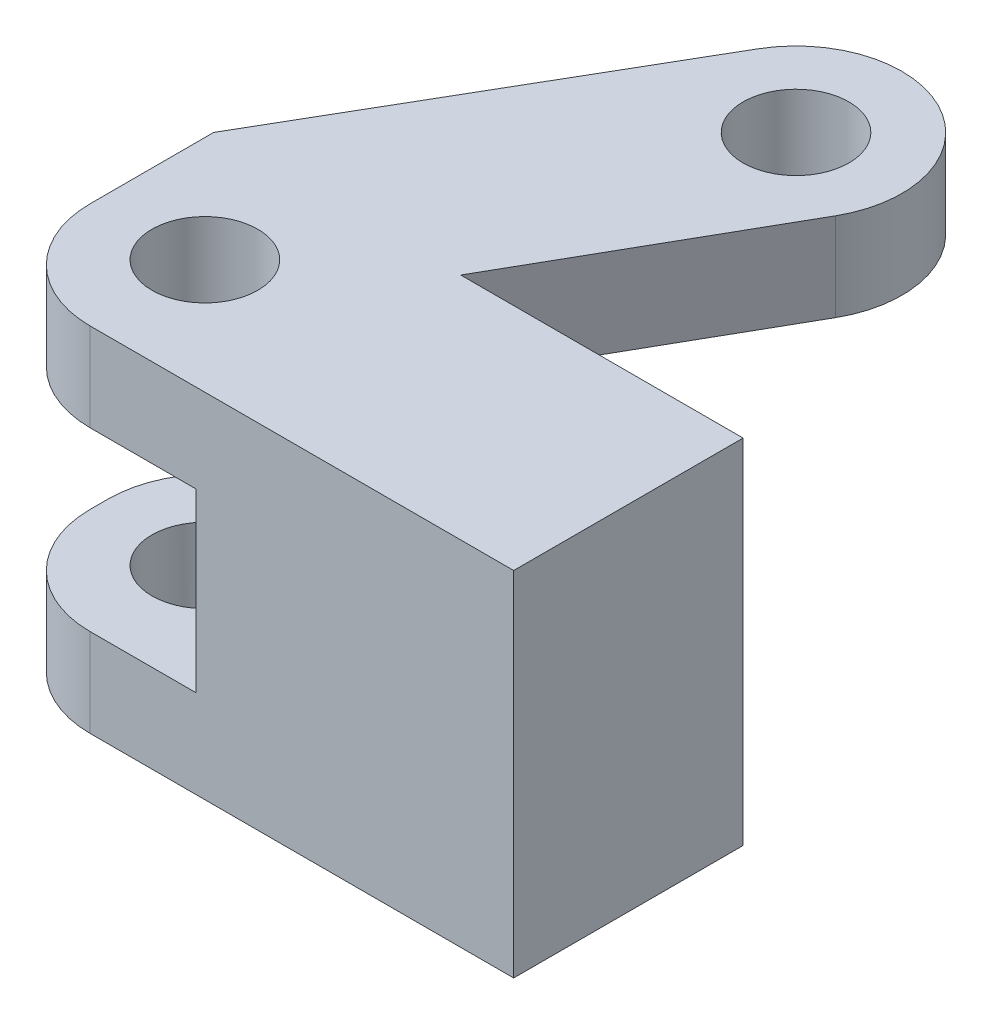
ISO-10303-21;
HEADER;
FILE_DESCRIPTION(('STEP AP214'),'2;1');
FILE_NAME('part.step','',(''),(''),'','','');
FILE_SCHEMA(('AUTOMOTIVE_DESIGN { 1 0 10303 214 1 1 1 1 }'));
ENDSEC;
DATA;
#1=APPLICATION_CONTEXT('core data for automotive mechanical design processes');
#2=APPLICATION_PROTOCOL_DEFINITION('international standard','automotive_design',2000,#1);
#3=PRODUCT_CONTEXT('',#1,'mechanical');
#4=PRODUCT('Part','Part','',(#3));
#5=PRODUCT_RELATED_PRODUCT_CATEGORY('part','',(#4));
#6=PRODUCT_DEFINITION_FORMATION('','',#4);
#7=PRODUCT_DEFINITION_CONTEXT('part definition',#1,'design');
#8=PRODUCT_DEFINITION('design','',#6,#7);
#9=PRODUCT_DEFINITION_SHAPE('','',#8);
#10=(LENGTH_UNIT() NAMED_UNIT(*) SI_UNIT(.MILLI.,.METRE.));
#11=(NAMED_UNIT(*) PLANE_ANGLE_UNIT() SI_UNIT($,.RADIAN.));
#12=(NAMED_UNIT(*) SI_UNIT($,.STERADIAN.) SOLID_ANGLE_UNIT());
#13=UNCERTAINTY_MEASURE_WITH_UNIT(LENGTH_MEASURE(1.E-05),#10,'distance_accuracy_value','');
#14=(GEOMETRIC_REPRESENTATION_CONTEXT(3) GLOBAL_UNCERTAINTY_ASSIGNED_CONTEXT((#13)) GLOBAL_UNIT_ASSIGNED_CONTEXT((#10,
#11,#12)) REPRESENTATION_CONTEXT('',''));
#15=CARTESIAN_POINT('',(0.,0.,0.));
#16=DIRECTION('',(0.,0.,1.));
#17=DIRECTION('',(1.,0.,0.));
#18=AXIS2_PLACEMENT_3D('',#15,#16,#17);
#19=CARTESIAN_POINT('',(-15.,10.,-6.5));
#20=DIRECTION('',(1.,0.,0.));
#21=DIRECTION('',(0.,0.,-1.));
#22=AXIS2_PLACEMENT_3D('',#19,#20,#21);
#23=PLANE('',#22);
#24=DIRECTION('',(0.,0.,1.));
#25=VECTOR('',#24,1.);
#26=CARTESIAN_POINT('',(-15.,5.,-6.5));
#27=LINE('',#26,#25);
#28=CARTESIAN_POINT('',(-15.,5.,-6.5));
#29=VERTEX_POINT('',#28);
#30=CARTESIAN_POINT('',(-15.,5.,0.5));
#31=VERTEX_POINT('',#30);
#32=EDGE_CURVE('E165',#29,#31,#27,.T.);
#33=ORIENTED_EDGE('',*,*,#32,.T.);
#34=DIRECTION('',(0.,-1.,0.));
#35=VECTOR('',#34,1.);
#36=CARTESIAN_POINT('',(-15.,10.,0.5));
#37=LINE('',#36,#35);
#38=CARTESIAN_POINT('',(-15.,10.,0.499999999999998));
#39=VERTEX_POINT('',#38);
#40=EDGE_CURVE('E252',#31,#39,#37,.F.);
#41=ORIENTED_EDGE('',*,*,#40,.T.);
#42=DIRECTION('',(0.,0.,1.));
#43=VECTOR('',#42,1.);
#44=CARTESIAN_POINT('',(-15.,10.,-6.5));
#45=LINE('',#44,#43);
#46=CARTESIAN_POINT('',(-15.,10.,-6.5));
#47=VERTEX_POINT('',#46);
#48=EDGE_CURVE('E212',#47,#39,#45,.T.);
#49=ORIENTED_EDGE('',*,*,#48,.F.);
#50=DIRECTION('',(0.,-1.,0.));
#51=VECTOR('',#50,1.);
#52=CARTESIAN_POINT('',(-15.,10.,-6.5));
#53=LINE('',#52,#51);
#54=EDGE_CURVE('E228',#47,#29,#53,.T.);
#55=ORIENTED_EDGE('',*,*,#54,.T.);
#56=EDGE_LOOP('',(#33,#41,#49,#55));
#57=FACE_BOUND('',#56,.T.);
#58=ADVANCED_FACE('F41',(#57),#23,.F.);
#59=CARTESIAN_POINT('',(15.,10.,-6.5));
#60=DIRECTION('',(-1.,0.,0.));
#61=DIRECTION('',(0.,0.,1.));
#62=AXIS2_PLACEMENT_3D('',#59,#60,#61);
#63=PLANE('',#62);
#64=DIRECTION('',(0.,0.,-1.));
#65=VECTOR('',#64,1.);
#66=CARTESIAN_POINT('',(15.,-10.,-6.5));
#67=LINE('',#66,#65);
#68=CARTESIAN_POINT('',(15.,-10.,6.5));
#69=VERTEX_POINT('',#68);
#70=CARTESIAN_POINT('',(15.,-10.,-6.5));
#71=VERTEX_POINT('',#70);
#72=EDGE_CURVE('E204',#69,#71,#67,.T.);
#73=ORIENTED_EDGE('',*,*,#72,.T.);
#74=DIRECTION('',(0.,-1.,0.));
#75=VECTOR('',#74,1.);
#76=CARTESIAN_POINT('',(15.,10.,-6.5));
#77=LINE('',#76,#75);
#78=CARTESIAN_POINT('',(15.,10.,-6.5));
#79=VERTEX_POINT('',#78);
#80=EDGE_CURVE('E230',#79,#71,#77,.T.);
#81=ORIENTED_EDGE('',*,*,#80,.F.);
#82=DIRECTION('',(0.,0.,-1.));
#83=VECTOR('',#82,1.);
#84=CARTESIAN_POINT('',(15.,10.,-6.5));
#85=LINE('',#84,#83);
#86=CARTESIAN_POINT('',(15.,10.,6.5));
#87=VERTEX_POINT('',#86);
#88=EDGE_CURVE('E205',#87,#79,#85,.T.);
#89=ORIENTED_EDGE('',*,*,#88,.F.);
#90=DIRECTION('',(0.,-1.,0.));
#91=VECTOR('',#90,1.);
#92=CARTESIAN_POINT('',(15.,10.,6.5));
#93=LINE('',#92,#91);
#94=EDGE_CURVE('E217',#87,#69,#93,.T.);
#95=ORIENTED_EDGE('',*,*,#94,.T.);
#96=EDGE_LOOP('',(#73,#81,#89,#95));
#97=FACE_BOUND('',#96,.T.);
#98=ADVANCED_FACE('F289',(#97),#63,.F.);
#99=CARTESIAN_POINT('',(-15.,10.,-6.5));
#100=DIRECTION('',(0.,0.,1.));
#101=DIRECTION('',(1.,0.,0.));
#102=AXIS2_PLACEMENT_3D('',#99,#100,#101);
#103=PLANE('',#102);
#104=DIRECTION('',(-1.,0.,0.));
#105=VECTOR('',#104,1.);
#106=CARTESIAN_POINT('',(-15.,-10.,-6.5));
#107=LINE('',#106,#105);
#108=CARTESIAN_POINT('',(-8.99999999999999,-10.,-6.5));
#109=VERTEX_POINT('',#108);
#110=EDGE_CURVE('E220',#71,#109,#107,.T.);
#111=ORIENTED_EDGE('',*,*,#110,.T.);
#112=DIRECTION('',(0.,-1.,0.));
#113=VECTOR('',#112,1.);
#114=CARTESIAN_POINT('',(-8.99999999999999,10.,-6.5));
#115=LINE('',#114,#113);
#116=CARTESIAN_POINT('',(-8.99999999999999,-5.,-6.5));
#117=VERTEX_POINT('',#116);
#118=EDGE_CURVE('E11',#109,#117,#115,.F.);
#119=ORIENTED_EDGE('',*,*,#118,.T.);
#120=DIRECTION('',(-1.,0.,0.));
#121=VECTOR('',#120,1.);
#122=CARTESIAN_POINT('',(-27.,-5.,-6.5));
#123=LINE('',#122,#121);
#124=CARTESIAN_POINT('',(-2.99999999999999,-5.,-6.5));
#125=VERTEX_POINT('',#124);
#126=EDGE_CURVE('E194',#125,#117,#123,.T.);
#127=ORIENTED_EDGE('',*,*,#126,.F.);
#128=DIRECTION('',(0.,-1.,0.));
#129=VECTOR('',#128,1.);
#130=CARTESIAN_POINT('',(-2.99999999999999,-5.,-6.5));
#131=LINE('',#130,#129);
#132=CARTESIAN_POINT('',(-2.99999999999999,5.,-6.5));
#133=VERTEX_POINT('',#132);
#134=EDGE_CURVE('E189',#133,#125,#131,.T.);
#135=ORIENTED_EDGE('',*,*,#134,.F.);
#136=DIRECTION('',(1.,0.,0.));
#137=VECTOR('',#136,1.);
#138=CARTESIAN_POINT('',(-15.,5.,-6.5));
#139=LINE('',#138,#137);
#140=CARTESIAN_POINT('',(-0.999999999999994,5.,-6.5));
#141=VERTEX_POINT('',#140);
#142=EDGE_CURVE('E178',#133,#141,#139,.T.);
#143=ORIENTED_EDGE('',*,*,#142,.T.);
#144=DIRECTION('',(0.,1.,0.));
#145=VECTOR('',#144,1.);
#146=CARTESIAN_POINT('',(-0.999999999999994,5.,-6.5));
#147=LINE('',#146,#145);
#148=CARTESIAN_POINT('',(-0.999999999999994,10.,-6.5));
#149=VERTEX_POINT('',#148);
#150=EDGE_CURVE('E153',#141,#149,#147,.T.);
#151=ORIENTED_EDGE('',*,*,#150,.T.);
#152=DIRECTION('',(-1.,0.,0.));
#153=VECTOR('',#152,1.);
#154=CARTESIAN_POINT('',(-15.,10.,-6.5));
#155=LINE('',#154,#153);
#156=EDGE_CURVE('E208',#79,#149,#155,.T.);
#157=ORIENTED_EDGE('',*,*,#156,.F.);
#158=ORIENTED_EDGE('',*,*,#80,.T.);
#159=EDGE_LOOP('',(#111,#119,#127,#135,#143,#151,#157,#158));
#160=FACE_BOUND('',#159,.T.);
#161=ADVANCED_FACE('F285',(#160),#103,.F.);
#162=DIRECTION('',(0.,0.,1.));
#163=VECTOR('',#162,1.);
#164=CARTESIAN_POINT('',(-15.,-10.,-6.5));
#165=LINE('',#164,#163);
#166=CARTESIAN_POINT('',(-15.,-10.,-0.500000000000001));
#167=VERTEX_POINT('',#166);
#168=CARTESIAN_POINT('',(-15.,-10.,0.499999999999998));
#169=VERTEX_POINT('',#168);
#170=EDGE_CURVE('E222',#167,#169,#165,.T.);
#171=ORIENTED_EDGE('',*,*,#170,.T.);
#172=DIRECTION('',(0.,-1.,0.));
#173=VECTOR('',#172,1.);
#174=CARTESIAN_POINT('',(-15.,10.,0.5));
#175=LINE('',#174,#173);
#176=CARTESIAN_POINT('',(-15.,-5.,0.5));
#177=VERTEX_POINT('',#176);
#178=EDGE_CURVE('E263',#169,#177,#175,.F.);
#179=ORIENTED_EDGE('',*,*,#178,.T.);
#180=DIRECTION('',(0.,0.,-1.));
#181=VECTOR('',#180,1.);
#182=CARTESIAN_POINT('',(-15.,-5.,-6.5));
#183=LINE('',#182,#181);
#184=CARTESIAN_POINT('',(-15.,-5.,-0.5));
#185=VERTEX_POINT('',#184);
#186=EDGE_CURVE('E200',#177,#185,#183,.T.);
#187=ORIENTED_EDGE('',*,*,#186,.T.);
#188=DIRECTION('',(0.,-1.,0.));
#189=VECTOR('',#188,1.);
#190=CARTESIAN_POINT('',(-15.,10.,-0.5));
#191=LINE('',#190,#189);
#192=EDGE_CURVE('E260',#185,#167,#191,.T.);
#193=ORIENTED_EDGE('',*,*,#192,.T.);
#194=EDGE_LOOP('',(#171,#179,#187,#193));
#195=FACE_BOUND('',#194,.T.);
#196=ADVANCED_FACE('F282',(#195),#23,.F.);
#197=CARTESIAN_POINT('',(-15.,10.,6.5));
#198=DIRECTION('',(0.,0.,-1.));
#199=DIRECTION('',(-1.,0.,0.));
#200=AXIS2_PLACEMENT_3D('',#197,#198,#199);
#201=PLANE('',#200);
#202=DIRECTION('',(1.,0.,0.));
#203=VECTOR('',#202,1.);
#204=CARTESIAN_POINT('',(-15.,10.,6.5));
#205=LINE('',#204,#203);
#206=CARTESIAN_POINT('',(-8.99999999999999,10.,6.5));
#207=VERTEX_POINT('',#206);
#208=EDGE_CURVE('E215',#207,#87,#205,.T.);
#209=ORIENTED_EDGE('',*,*,#208,.F.);
#210=DIRECTION('',(0.,-1.,0.));
#211=VECTOR('',#210,1.);
#212=CARTESIAN_POINT('',(-8.99999999999999,10.,6.5));
#213=LINE('',#212,#211);
#214=CARTESIAN_POINT('',(-8.99999999999999,5.,6.5));
#215=VERTEX_POINT('',#214);
#216=EDGE_CURVE('E247',#207,#215,#213,.T.);
#217=ORIENTED_EDGE('',*,*,#216,.T.);
#218=DIRECTION('',(1.,0.,0.));
#219=VECTOR('',#218,1.);
#220=CARTESIAN_POINT('',(-15.,5.,6.5));
#221=LINE('',#220,#219);
#222=CARTESIAN_POINT('',(-2.99999999999999,5.,6.5));
#223=VERTEX_POINT('',#222);
#224=EDGE_CURVE('E182',#215,#223,#221,.T.);
#225=ORIENTED_EDGE('',*,*,#224,.T.);
#226=DIRECTION('',(0.,-1.,0.));
#227=VECTOR('',#226,1.);
#228=CARTESIAN_POINT('',(-2.99999999999999,10.,6.5));
#229=LINE('',#228,#227);
#230=CARTESIAN_POINT('',(-2.99999999999999,-5.,6.5));
#231=VERTEX_POINT('',#230);
#232=EDGE_CURVE('E236',#223,#231,#229,.T.);
#233=ORIENTED_EDGE('',*,*,#232,.T.);
#234=DIRECTION('',(-1.,0.,0.));
#235=VECTOR('',#234,1.);
#236=CARTESIAN_POINT('',(-15.,-5.,6.5));
#237=LINE('',#236,#235);
#238=CARTESIAN_POINT('',(-8.99999999999999,-5.,6.5));
#239=VERTEX_POINT('',#238);
#240=EDGE_CURVE('E233',#231,#239,#237,.T.);
#241=ORIENTED_EDGE('',*,*,#240,.T.);
#242=DIRECTION('',(0.,-1.,0.));
#243=VECTOR('',#242,1.);
#244=CARTESIAN_POINT('',(-8.99999999999999,10.,6.5));
#245=LINE('',#244,#243);
#246=CARTESIAN_POINT('',(-8.99999999999999,-10.,6.5));
#247=VERTEX_POINT('',#246);
#248=EDGE_CURVE('E181',#239,#247,#245,.T.);
#249=ORIENTED_EDGE('',*,*,#248,.T.);
#250=DIRECTION('',(1.,0.,0.));
#251=VECTOR('',#250,1.);
#252=CARTESIAN_POINT('',(-15.,-10.,6.5));
#253=LINE('',#252,#251);
#254=EDGE_CURVE('E209',#247,#69,#253,.T.);
#255=ORIENTED_EDGE('',*,*,#254,.T.);
#256=ORIENTED_EDGE('',*,*,#94,.F.);
#257=EDGE_LOOP('',(#209,#217,#225,#233,#241,#249,#255,#256));
#258=FACE_BOUND('',#257,.T.);
#259=ADVANCED_FACE('F273',(#258),#201,.F.);
#260=CARTESIAN_POINT('',(0.,10.,0.));
#261=DIRECTION('',(0.,1.,0.));
#262=DIRECTION('',(0.,0.,1.));
#263=AXIS2_PLACEMENT_3D('',#260,#261,#262);
#264=PLANE('',#263);
#265=CARTESIAN_POINT('',(-8.99999999999999,10.,0.));
#266=DIRECTION('',(0.,1.,0.));
#267=DIRECTION('',(0.,0.,1.));
#268=AXIS2_PLACEMENT_3D('',#265,#266,#267);
#269=CIRCLE('',#268,3.);
#270=CARTESIAN_POINT('',(-8.99999999999999,10.,3.));
#271=VERTEX_POINT('',#270);
#272=EDGE_CURVE('E475',#271,#271,#269,.T.);
#273=ORIENTED_EDGE('',*,*,#272,.F.);
#274=EDGE_LOOP('',(#273));
#275=FACE_BOUND('',#274,.T.);
#276=ORIENTED_EDGE('',*,*,#48,.T.);
#277=CARTESIAN_POINT('',(-8.99999999999999,10.,0.499999999999999));
#278=DIRECTION('',(0.,1.,0.));
#279=DIRECTION('',(0.,0.,1.));
#280=AXIS2_PLACEMENT_3D('',#277,#278,#279);
#281=CIRCLE('',#280,6.);
#282=EDGE_CURVE('E254',#39,#207,#281,.T.);
#283=ORIENTED_EDGE('',*,*,#282,.T.);
#284=ORIENTED_EDGE('',*,*,#208,.T.);
#285=ORIENTED_EDGE('',*,*,#88,.T.);
#286=ORIENTED_EDGE('',*,*,#156,.T.);
#287=DIRECTION('',(0.495264017077176,0.,-0.868742512709363));
#288=VECTOR('',#287,1.);
#289=CARTESIAN_POINT('',(-0.999999999999994,10.,-6.5));
#290=LINE('',#289,#288);
#291=CARTESIAN_POINT('',(6.71245507625619,10.,-20.0284158975369));
#292=VERTEX_POINT('',#291);
#293=EDGE_CURVE('E170',#149,#292,#290,.T.);
#294=ORIENTED_EDGE('',*,*,#293,.T.);
#295=CARTESIAN_POINT('',(1.50000000000001,10.,-23.));
#296=DIRECTION('',(0.,1.,0.));
#297=DIRECTION('',(0.,0.,1.));
#298=AXIS2_PLACEMENT_3D('',#295,#296,#297);
#299=CIRCLE('',#298,6.);
#300=CARTESIAN_POINT('',(-3.69089901228351,10.,-26.0090808304653));
#301=VERTEX_POINT('',#300);
#302=EDGE_CURVE('E184',#292,#301,#299,.T.);
#303=ORIENTED_EDGE('',*,*,#302,.T.);
#304=DIRECTION('',(-0.501513471744223,0.,0.865149835380587));
#305=VECTOR('',#304,1.);
#306=CARTESIAN_POINT('',(-3.69089901228351,10.,-26.0090808304653));
#307=LINE('',#306,#305);
#308=EDGE_CURVE('E148',#301,#47,#307,.T.);
#309=ORIENTED_EDGE('',*,*,#308,.T.);
#310=EDGE_LOOP('',(#276,#283,#284,#285,#286,#294,#303,#309));
#311=FACE_BOUND('',#310,.T.);
#312=CARTESIAN_POINT('',(1.50000000000001,10.,-23.));
#313=DIRECTION('',(0.,1.,0.));
#314=DIRECTION('',(0.,0.,1.));
#315=AXIS2_PLACEMENT_3D('',#312,#313,#314);
#316=CIRCLE('',#315,3.);
#317=CARTESIAN_POINT('',(1.50000000000001,10.,-20.));
#318=VERTEX_POINT('',#317);
#319=EDGE_CURVE('E175',#318,#318,#316,.T.);
#320=ORIENTED_EDGE('',*,*,#319,.F.);
#321=EDGE_LOOP('',(#320));
#322=FACE_BOUND('',#321,.T.);
#323=ADVANCED_FACE('F300',(#275,#311,#322),#264,.T.);
#324=CARTESIAN_POINT('',(0.,-10.,0.));
#325=DIRECTION('',(0.,1.,0.));
#326=DIRECTION('',(0.,0.,1.));
#327=AXIS2_PLACEMENT_3D('',#324,#325,#326);
#328=PLANE('',#327);
#329=CARTESIAN_POINT('',(-8.99999999999999,-10.,0.));
#330=DIRECTION('',(0.,1.,0.));
#331=DIRECTION('',(0.,0.,1.));
#332=AXIS2_PLACEMENT_3D('',#329,#330,#331);
#333=CIRCLE('',#332,3.);
#334=CARTESIAN_POINT('',(-8.99999999999999,-10.,3.));
#335=VERTEX_POINT('',#334);
#336=EDGE_CURVE('E244',#335,#335,#333,.T.);
#337=ORIENTED_EDGE('',*,*,#336,.T.);
#338=EDGE_LOOP('',(#337));
#339=FACE_BOUND('',#338,.T.);
#340=ORIENTED_EDGE('',*,*,#254,.F.);
#341=CARTESIAN_POINT('',(-8.99999999999999,-10.,0.499999999999999));
#342=DIRECTION('',(0.,1.,0.));
#343=DIRECTION('',(0.,0.,1.));
#344=AXIS2_PLACEMENT_3D('',#341,#342,#343);
#345=CIRCLE('',#344,6.);
#346=EDGE_CURVE('E258',#247,#169,#345,.F.);
#347=ORIENTED_EDGE('',*,*,#346,.T.);
#348=ORIENTED_EDGE('',*,*,#170,.F.);
#349=CARTESIAN_POINT('',(-8.99999999999999,-10.,-0.5));
#350=DIRECTION('',(0.,1.,0.));
#351=DIRECTION('',(0.,0.,1.));
#352=AXIS2_PLACEMENT_3D('',#349,#350,#351);
#353=CIRCLE('',#352,6.);
#354=EDGE_CURVE('E256',#167,#109,#353,.F.);
#355=ORIENTED_EDGE('',*,*,#354,.T.);
#356=ORIENTED_EDGE('',*,*,#110,.F.);
#357=ORIENTED_EDGE('',*,*,#72,.F.);
#358=EDGE_LOOP('',(#340,#347,#348,#355,#356,#357));
#359=FACE_BOUND('',#358,.T.);
#360=ADVANCED_FACE('F279',(#339,#359),#328,.F.);
#361=CARTESIAN_POINT('',(-2.99999999999999,-5.,13.5));
#362=DIRECTION('',(1.,0.,0.));
#363=DIRECTION('',(0.,0.,-1.));
#364=AXIS2_PLACEMENT_3D('',#361,#362,#363);
#365=PLANE('',#364);
#366=DIRECTION('',(0.,0.,-1.));
#367=VECTOR('',#366,1.);
#368=CARTESIAN_POINT('',(-2.99999999999999,5.,13.5));
#369=LINE('',#368,#367);
#370=EDGE_CURVE('E197',#223,#133,#369,.T.);
#371=ORIENTED_EDGE('',*,*,#370,.T.);
#372=ORIENTED_EDGE('',*,*,#134,.T.);
#373=DIRECTION('',(0.,0.,-1.));
#374=VECTOR('',#373,1.);
#375=CARTESIAN_POINT('',(-2.99999999999999,-5.,13.5));
#376=LINE('',#375,#374);
#377=EDGE_CURVE('E196',#231,#125,#376,.T.);
#378=ORIENTED_EDGE('',*,*,#377,.F.);
#379=ORIENTED_EDGE('',*,*,#232,.F.);
#380=EDGE_LOOP('',(#371,#372,#378,#379));
#381=FACE_BOUND('',#380,.T.);
#382=ADVANCED_FACE('F306',(#381),#365,.F.);
#383=CARTESIAN_POINT('',(-27.,5.,13.5));
#384=DIRECTION('',(0.,1.,0.));
#385=DIRECTION('',(0.,0.,1.));
#386=AXIS2_PLACEMENT_3D('',#383,#384,#385);
#387=PLANE('',#386);
#388=CARTESIAN_POINT('',(-8.99999999999999,5.,0.));
#389=DIRECTION('',(0.,1.,0.));
#390=DIRECTION('',(0.,0.,1.));
#391=AXIS2_PLACEMENT_3D('',#388,#389,#390);
#392=CIRCLE('',#391,3.);
#393=CARTESIAN_POINT('',(-8.99999999999999,5.,3.));
#394=VERTEX_POINT('',#393);
#395=EDGE_CURVE('E243',#394,#394,#392,.T.);
#396=ORIENTED_EDGE('',*,*,#395,.T.);
#397=EDGE_LOOP('',(#396));
#398=FACE_BOUND('',#397,.T.);
#399=ORIENTED_EDGE('',*,*,#224,.F.);
#400=CARTESIAN_POINT('',(-8.99999999999999,5.,0.499999999999999));
#401=DIRECTION('',(0.,1.,0.));
#402=DIRECTION('',(0.,0.,1.));
#403=AXIS2_PLACEMENT_3D('',#400,#401,#402);
#404=CIRCLE('',#403,6.);
#405=EDGE_CURVE('E250',#215,#31,#404,.F.);
#406=ORIENTED_EDGE('',*,*,#405,.T.);
#407=ORIENTED_EDGE('',*,*,#32,.F.);
#408=DIRECTION('',(-0.501513471744223,0.,0.865149835380587));
#409=VECTOR('',#408,1.);
#410=CARTESIAN_POINT('',(-3.69089901228351,5.,-26.0090808304653));
#411=LINE('',#410,#409);
#412=CARTESIAN_POINT('',(-3.69089901228351,5.,-26.0090808304653));
#413=VERTEX_POINT('',#412);
#414=EDGE_CURVE('E145',#413,#29,#411,.T.);
#415=ORIENTED_EDGE('',*,*,#414,.F.);
#416=CARTESIAN_POINT('',(1.50000000000001,5.,-23.));
#417=DIRECTION('',(0.,1.,0.));
#418=DIRECTION('',(0.,0.,1.));
#419=AXIS2_PLACEMENT_3D('',#416,#417,#418);
#420=CIRCLE('',#419,6.);
#421=CARTESIAN_POINT('',(6.71245507625619,5.,-20.0284158975369));
#422=VERTEX_POINT('',#421);
#423=EDGE_CURVE('E162',#422,#413,#420,.T.);
#424=ORIENTED_EDGE('',*,*,#423,.F.);
#425=DIRECTION('',(0.495264017077176,0.,-0.868742512709363));
#426=VECTOR('',#425,1.);
#427=CARTESIAN_POINT('',(-0.999999999999994,5.,-6.5));
#428=LINE('',#427,#426);
#429=EDGE_CURVE('E154',#141,#422,#428,.T.);
#430=ORIENTED_EDGE('',*,*,#429,.F.);
#431=ORIENTED_EDGE('',*,*,#142,.F.);
#432=ORIENTED_EDGE('',*,*,#370,.F.);
#433=EDGE_LOOP('',(#399,#406,#407,#415,#424,#430,#431,#432));
#434=FACE_BOUND('',#433,.T.);
#435=CARTESIAN_POINT('',(1.50000000000001,5.,-23.));
#436=DIRECTION('',(0.,1.,0.));
#437=DIRECTION('',(0.,0.,1.));
#438=AXIS2_PLACEMENT_3D('',#435,#436,#437);
#439=CIRCLE('',#438,3.);
#440=CARTESIAN_POINT('',(1.50000000000001,5.,-20.));
#441=VERTEX_POINT('',#440);
#442=EDGE_CURVE('E186',#441,#441,#439,.T.);
#443=ORIENTED_EDGE('',*,*,#442,.T.);
#444=EDGE_LOOP('',(#443));
#445=FACE_BOUND('',#444,.T.);
#446=ADVANCED_FACE('F159',(#398,#434,#445),#387,.F.);
#447=CARTESIAN_POINT('',(-27.,-5.,13.5));
#448=DIRECTION('',(0.,-1.,0.));
#449=DIRECTION('',(0.,0.,-1.));
#450=AXIS2_PLACEMENT_3D('',#447,#448,#449);
#451=PLANE('',#450);
#452=CARTESIAN_POINT('',(-8.99999999999999,-5.,0.));
#453=DIRECTION('',(0.,-1.,0.));
#454=DIRECTION('',(0.,0.,-1.));
#455=AXIS2_PLACEMENT_3D('',#452,#453,#454);
#456=CIRCLE('',#455,3.);
#457=CARTESIAN_POINT('',(-8.99999999999999,-5.,-3.));
#458=VERTEX_POINT('',#457);
#459=EDGE_CURVE('E240',#458,#458,#456,.T.);
#460=ORIENTED_EDGE('',*,*,#459,.T.);
#461=EDGE_LOOP('',(#460));
#462=FACE_BOUND('',#461,.T.);
#463=ORIENTED_EDGE('',*,*,#186,.F.);
#464=CARTESIAN_POINT('',(-8.99999999999999,-5.,0.499999999999999));
#465=DIRECTION('',(0.,-1.,0.));
#466=DIRECTION('',(0.,0.,-1.));
#467=AXIS2_PLACEMENT_3D('',#464,#465,#466);
#468=CIRCLE('',#467,6.);
#469=EDGE_CURVE('E49',#177,#239,#468,.F.);
#470=ORIENTED_EDGE('',*,*,#469,.T.);
#471=ORIENTED_EDGE('',*,*,#240,.F.);
#472=ORIENTED_EDGE('',*,*,#377,.T.);
#473=ORIENTED_EDGE('',*,*,#126,.T.);
#474=CARTESIAN_POINT('',(-8.99999999999999,-5.,-0.5));
#475=DIRECTION('',(0.,-1.,0.));
#476=DIRECTION('',(0.,0.,-1.));
#477=AXIS2_PLACEMENT_3D('',#474,#475,#476);
#478=CIRCLE('',#477,6.);
#479=EDGE_CURVE('E61',#117,#185,#478,.F.);
#480=ORIENTED_EDGE('',*,*,#479,.T.);
#481=EDGE_LOOP('',(#463,#470,#471,#472,#473,#480));
#482=FACE_BOUND('',#481,.T.);
#483=ADVANCED_FACE('F266',(#462,#482),#451,.F.);
#484=CARTESIAN_POINT('',(1.50000000000001,5.,-23.));
#485=DIRECTION('',(0.,1.,0.));
#486=DIRECTION('',(0.,0.,1.));
#487=AXIS2_PLACEMENT_3D('',#484,#485,#486);
#488=CYLINDRICAL_SURFACE('',#487,6.);
#489=ORIENTED_EDGE('',*,*,#302,.F.);
#490=DIRECTION('',(0.,1.,0.));
#491=VECTOR('',#490,1.);
#492=CARTESIAN_POINT('',(6.71245507625619,5.,-20.0284158975369));
#493=LINE('',#492,#491);
#494=EDGE_CURVE('E169',#422,#292,#493,.T.);
#495=ORIENTED_EDGE('',*,*,#494,.F.);
#496=ORIENTED_EDGE('',*,*,#423,.T.);
#497=DIRECTION('',(0.,1.,0.));
#498=VECTOR('',#497,1.);
#499=CARTESIAN_POINT('',(-3.69089901228351,5.,-26.0090808304653));
#500=LINE('',#499,#498);
#501=EDGE_CURVE('E142',#413,#301,#500,.T.);
#502=ORIENTED_EDGE('',*,*,#501,.T.);
#503=EDGE_LOOP('',(#489,#495,#496,#502));
#504=FACE_BOUND('',#503,.T.);
#505=ADVANCED_FACE('F168',(#504),#488,.T.);
#506=CARTESIAN_POINT('',(-0.999999999999994,5.,-6.5));
#507=DIRECTION('',(0.868742512709363,0.,0.495264017077176));
#508=DIRECTION('',(0.495264017077176,0.,-0.868742512709363));
#509=AXIS2_PLACEMENT_3D('',#506,#507,#508);
#510=PLANE('',#509);
#511=ORIENTED_EDGE('',*,*,#293,.F.);
#512=ORIENTED_EDGE('',*,*,#150,.F.);
#513=ORIENTED_EDGE('',*,*,#429,.T.);
#514=ORIENTED_EDGE('',*,*,#494,.T.);
#515=EDGE_LOOP('',(#511,#512,#513,#514));
#516=FACE_BOUND('',#515,.T.);
#517=ADVANCED_FACE('F303',(#516),#510,.T.);
#518=CARTESIAN_POINT('',(-3.69089901228351,5.,-26.0090808304653));
#519=DIRECTION('',(-0.865149835380587,0.,-0.501513471744223));
#520=DIRECTION('',(-0.501513471744223,0.,0.865149835380587));
#521=AXIS2_PLACEMENT_3D('',#518,#519,#520);
#522=PLANE('',#521);
#523=ORIENTED_EDGE('',*,*,#308,.F.);
#524=ORIENTED_EDGE('',*,*,#501,.F.);
#525=ORIENTED_EDGE('',*,*,#414,.T.);
#526=ORIENTED_EDGE('',*,*,#54,.F.);
#527=EDGE_LOOP('',(#523,#524,#525,#526));
#528=FACE_BOUND('',#527,.T.);
#529=ADVANCED_FACE('F144',(#528),#522,.T.);
#530=CARTESIAN_POINT('',(1.50000000000001,5.,-23.));
#531=DIRECTION('',(0.,1.,0.));
#532=DIRECTION('',(0.,0.,1.));
#533=AXIS2_PLACEMENT_3D('',#530,#531,#532);
#534=CYLINDRICAL_SURFACE('',#533,3.);
#535=ORIENTED_EDGE('',*,*,#442,.F.);
#536=EDGE_LOOP('',(#535));
#537=FACE_BOUND('',#536,.T.);
#538=ORIENTED_EDGE('',*,*,#319,.T.);
#539=EDGE_LOOP('',(#538));
#540=FACE_BOUND('',#539,.T.);
#541=ADVANCED_FACE('F375',(#537,#540),#534,.F.);
#542=CARTESIAN_POINT('',(-8.99999999999999,-10.,0.));
#543=DIRECTION('',(0.,1.,0.));
#544=DIRECTION('',(0.,0.,1.));
#545=AXIS2_PLACEMENT_3D('',#542,#543,#544);
#546=CYLINDRICAL_SURFACE('',#545,3.);
#547=ORIENTED_EDGE('',*,*,#336,.F.);
#548=EDGE_LOOP('',(#547));
#549=FACE_BOUND('',#548,.T.);
#550=ORIENTED_EDGE('',*,*,#459,.F.);
#551=EDGE_LOOP('',(#550));
#552=FACE_BOUND('',#551,.T.);
#553=ADVANCED_FACE('F365',(#549,#552),#546,.F.);
#554=ORIENTED_EDGE('',*,*,#272,.T.);
#555=EDGE_LOOP('',(#554));
#556=FACE_BOUND('',#555,.T.);
#557=ORIENTED_EDGE('',*,*,#395,.F.);
#558=EDGE_LOOP('',(#557));
#559=FACE_BOUND('',#558,.T.);
#560=ADVANCED_FACE('F338',(#556,#559),#546,.F.);
#561=CARTESIAN_POINT('',(-8.99999999999999,10.,0.499999999999999));
#562=DIRECTION('',(0.,-1.,0.));
#563=DIRECTION('',(0.,0.,-1.));
#564=AXIS2_PLACEMENT_3D('',#561,#562,#563);
#565=CYLINDRICAL_SURFACE('',#564,6.);
#566=ORIENTED_EDGE('',*,*,#282,.F.);
#567=ORIENTED_EDGE('',*,*,#40,.F.);
#568=ORIENTED_EDGE('',*,*,#405,.F.);
#569=ORIENTED_EDGE('',*,*,#216,.F.);
#570=EDGE_LOOP('',(#566,#567,#568,#569));
#571=FACE_BOUND('',#570,.T.);
#572=ADVANCED_FACE('F295',(#571),#565,.T.);
#573=CARTESIAN_POINT('',(-8.99999999999999,10.,0.499999999999999));
#574=DIRECTION('',(0.,-1.,0.));
#575=DIRECTION('',(0.,0.,-1.));
#576=AXIS2_PLACEMENT_3D('',#573,#574,#575);
#577=CYLINDRICAL_SURFACE('',#576,6.);
#578=ORIENTED_EDGE('',*,*,#469,.F.);
#579=ORIENTED_EDGE('',*,*,#178,.F.);
#580=ORIENTED_EDGE('',*,*,#346,.F.);
#581=ORIENTED_EDGE('',*,*,#248,.F.);
#582=EDGE_LOOP('',(#578,#579,#580,#581));
#583=FACE_BOUND('',#582,.T.);
#584=ADVANCED_FACE('F276',(#583),#577,.T.);
#585=CARTESIAN_POINT('',(-8.99999999999999,10.,-0.5));
#586=DIRECTION('',(0.,-1.,0.));
#587=DIRECTION('',(0.,0.,-1.));
#588=AXIS2_PLACEMENT_3D('',#585,#586,#587);
#589=CYLINDRICAL_SURFACE('',#588,6.);
#590=ORIENTED_EDGE('',*,*,#479,.F.);
#591=ORIENTED_EDGE('',*,*,#118,.F.);
#592=ORIENTED_EDGE('',*,*,#354,.F.);
#593=ORIENTED_EDGE('',*,*,#192,.F.);
#594=EDGE_LOOP('',(#590,#591,#592,#593));
#595=FACE_BOUND('',#594,.T.);
#596=ADVANCED_FACE('F43',(#595),#589,.T.);
#597=CLOSED_SHELL('',(#58,#98,#161,#196,#259,#323,#360,#382,#446,#483,#505,#517,#529,#541,#553,
#560,#572,#584,#596));
#598=MANIFOLD_SOLID_BREP('B2',#597);
#599=ADVANCED_BREP_SHAPE_REPRESENTATION('',(#18,#598),#14);
#600=SHAPE_DEFINITION_REPRESENTATION(#9,#599);
ENDSEC;
END-ISO-10303-21;
